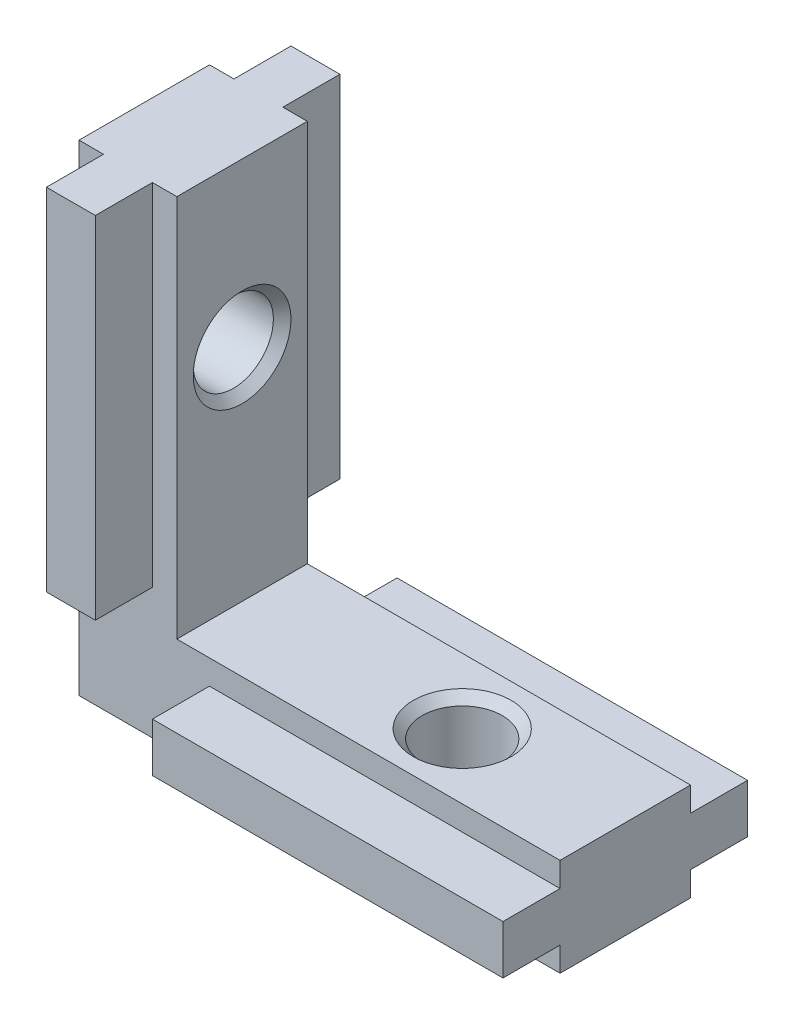
ISO-10303-21;
HEADER;
FILE_DESCRIPTION(('STEP AP214'),'2;1');
FILE_NAME('part.step','',(''),(''),'','','');
FILE_SCHEMA(('AUTOMOTIVE_DESIGN { 1 0 10303 214 1 1 1 1 }'));
ENDSEC;
DATA;
#1=APPLICATION_CONTEXT('core data for automotive mechanical design processes');
#2=APPLICATION_PROTOCOL_DEFINITION('international standard','automotive_design',2000,#1);
#3=PRODUCT_CONTEXT('',#1,'mechanical');
#4=PRODUCT('Part','Part','',(#3));
#5=PRODUCT_RELATED_PRODUCT_CATEGORY('part','',(#4));
#6=PRODUCT_DEFINITION_FORMATION('','',#4);
#7=PRODUCT_DEFINITION_CONTEXT('part definition',#1,'design');
#8=PRODUCT_DEFINITION('design','',#6,#7);
#9=PRODUCT_DEFINITION_SHAPE('','',#8);
#10=(LENGTH_UNIT() NAMED_UNIT(*) SI_UNIT(.MILLI.,.METRE.));
#11=(NAMED_UNIT(*) PLANE_ANGLE_UNIT() SI_UNIT($,.RADIAN.));
#12=(NAMED_UNIT(*) SI_UNIT($,.STERADIAN.) SOLID_ANGLE_UNIT());
#13=UNCERTAINTY_MEASURE_WITH_UNIT(LENGTH_MEASURE(1.E-05),#10,'distance_accuracy_value','');
#14=(GEOMETRIC_REPRESENTATION_CONTEXT(3) GLOBAL_UNCERTAINTY_ASSIGNED_CONTEXT((#13)) GLOBAL_UNIT_ASSIGNED_CONTEXT((#10,
#11,#12)) REPRESENTATION_CONTEXT('',''));
#15=CARTESIAN_POINT('',(0.,0.,0.));
#16=DIRECTION('',(0.,0.,1.));
#17=DIRECTION('',(1.,0.,0.));
#18=AXIS2_PLACEMENT_3D('',#15,#16,#17);
#19=CARTESIAN_POINT('',(6.,19.5,0.));
#20=DIRECTION('',(1.,0.,0.));
#21=DIRECTION('',(0.,0.,-1.));
#22=AXIS2_PLACEMENT_3D('',#19,#20,#21);
#23=CYLINDRICAL_SURFACE('',#22,2.45849999999999);
#24=CARTESIAN_POINT('',(0.540000000000873,19.5,0.));
#25=DIRECTION('',(-1.,0.,0.));
#26=DIRECTION('',(0.,0.,1.));
#27=AXIS2_PLACEMENT_3D('',#24,#25,#26);
#28=CIRCLE('',#27,2.45849999998882);
#29=CARTESIAN_POINT('',(0.540000000000873,19.5,2.45849999998882));
#30=VERTEX_POINT('',#29);
#31=EDGE_CURVE('E200',#30,#30,#28,.T.);
#32=ORIENTED_EDGE('',*,*,#31,.T.);
#33=EDGE_LOOP('',(#32));
#34=FACE_BOUND('',#33,.T.);
#35=CARTESIAN_POINT('',(5.46000000008462,19.5,0.));
#36=DIRECTION('',(1.,0.,0.));
#37=DIRECTION('',(0.,0.,-1.));
#38=AXIS2_PLACEMENT_3D('',#35,#36,#37);
#39=CIRCLE('',#38,2.45849999998882);
#40=CARTESIAN_POINT('',(5.46000000008462,19.5,-2.45849999998882));
#41=VERTEX_POINT('',#40);
#42=EDGE_CURVE('E211',#41,#41,#39,.T.);
#43=ORIENTED_EDGE('',*,*,#42,.T.);
#44=EDGE_LOOP('',(#43));
#45=FACE_BOUND('',#44,.T.);
#46=ADVANCED_FACE('F18',(#34,#45),#23,.F.);
#47=CARTESIAN_POINT('',(29.5,1.5,7.5));
#48=DIRECTION('',(0.,0.,-1.));
#49=DIRECTION('',(-1.,0.,0.));
#50=AXIS2_PLACEMENT_3D('',#47,#48,#49);
#51=PLANE('',#50);
#52=DIRECTION('',(1.,0.,0.));
#53=VECTOR('',#52,1.);
#54=CARTESIAN_POINT('',(0.,29.5,7.5));
#55=LINE('',#54,#53);
#56=CARTESIAN_POINT('',(4.5,29.5,7.5));
#57=VERTEX_POINT('',#56);
#58=CARTESIAN_POINT('',(1.5,29.5,7.5));
#59=VERTEX_POINT('',#58);
#60=EDGE_CURVE('E167',#57,#59,#55,.F.);
#61=ORIENTED_EDGE('',*,*,#60,.T.);
#62=DIRECTION('',(0.,1.,0.));
#63=VECTOR('',#62,1.);
#64=CARTESIAN_POINT('',(1.5,29.5,7.5));
#65=LINE('',#64,#63);
#66=CARTESIAN_POINT('',(1.5,8.,7.5));
#67=VERTEX_POINT('',#66);
#68=EDGE_CURVE('E164',#59,#67,#65,.F.);
#69=ORIENTED_EDGE('',*,*,#68,.T.);
#70=DIRECTION('',(1.,0.,0.));
#71=VECTOR('',#70,1.);
#72=CARTESIAN_POINT('',(8.,8.,7.5));
#73=LINE('',#72,#71);
#74=CARTESIAN_POINT('',(4.5,8.,7.5));
#75=VERTEX_POINT('',#74);
#76=EDGE_CURVE('E268',#75,#67,#73,.F.);
#77=ORIENTED_EDGE('',*,*,#76,.F.);
#78=DIRECTION('',(0.,1.,0.));
#79=VECTOR('',#78,1.);
#80=CARTESIAN_POINT('',(4.5,29.5,7.5));
#81=LINE('',#80,#79);
#82=EDGE_CURVE('E170',#75,#57,#81,.T.);
#83=ORIENTED_EDGE('',*,*,#82,.T.);
#84=EDGE_LOOP('',(#61,#69,#77,#83));
#85=FACE_BOUND('',#84,.T.);
#86=ADVANCED_FACE('F168',(#85),#51,.F.);
#87=CARTESIAN_POINT('',(19.5,6.00000000002865,0.));
#88=DIRECTION('',(0.,1.,0.));
#89=DIRECTION('',(0.,0.,1.));
#90=AXIS2_PLACEMENT_3D('',#87,#88,#89);
#91=CONICAL_SURFACE('',#90,2.99849999998969,0.785398163397448);
#92=CARTESIAN_POINT('',(19.5,6.00000000002865,0.));
#93=DIRECTION('',(0.,1.,0.));
#94=DIRECTION('',(0.,0.,1.));
#95=AXIS2_PLACEMENT_3D('',#92,#93,#94);
#96=CIRCLE('',#95,2.99849999998969);
#97=CARTESIAN_POINT('',(19.5,6.00000000002865,2.99849999998969));
#98=VERTEX_POINT('',#97);
#99=EDGE_CURVE('E21',#98,#98,#96,.T.);
#100=ORIENTED_EDGE('',*,*,#99,.T.);
#101=EDGE_LOOP('',(#100));
#102=FACE_BOUND('',#101,.T.);
#103=CARTESIAN_POINT('',(19.5,5.46,0.));
#104=DIRECTION('',(0.,1.,0.));
#105=DIRECTION('',(0.,0.,1.));
#106=AXIS2_PLACEMENT_3D('',#103,#104,#105);
#107=CIRCLE('',#106,2.4585);
#108=CARTESIAN_POINT('',(19.5,5.46,2.4585));
#109=VERTEX_POINT('',#108);
#110=EDGE_CURVE('E208',#109,#109,#107,.F.);
#111=ORIENTED_EDGE('',*,*,#110,.T.);
#112=EDGE_LOOP('',(#111));
#113=FACE_BOUND('',#112,.T.);
#114=ADVANCED_FACE('F500',(#102,#113),#91,.F.);
#115=CARTESIAN_POINT('',(6.00000000002865,19.5,0.));
#116=DIRECTION('',(1.,0.,0.));
#117=DIRECTION('',(0.,0.,-1.));
#118=AXIS2_PLACEMENT_3D('',#115,#116,#117);
#119=CONICAL_SURFACE('',#118,2.99849999993285,0.785398163397448);
#120=CARTESIAN_POINT('',(6.00000000002865,19.5,0.));
#121=DIRECTION('',(1.,0.,0.));
#122=DIRECTION('',(0.,0.,-1.));
#123=AXIS2_PLACEMENT_3D('',#120,#121,#122);
#124=CIRCLE('',#123,2.99849999993285);
#125=CARTESIAN_POINT('',(6.00000000002865,19.5,-2.99849999993285));
#126=VERTEX_POINT('',#125);
#127=EDGE_CURVE('E221',#126,#126,#124,.T.);
#128=ORIENTED_EDGE('',*,*,#127,.T.);
#129=EDGE_LOOP('',(#128));
#130=FACE_BOUND('',#129,.T.);
#131=ORIENTED_EDGE('',*,*,#42,.F.);
#132=EDGE_LOOP('',(#131));
#133=FACE_BOUND('',#132,.T.);
#134=ADVANCED_FACE('F496',(#130,#133),#119,.F.);
#135=CARTESIAN_POINT('',(29.5,4.5,-7.5));
#136=DIRECTION('',(0.,0.,1.));
#137=DIRECTION('',(1.,0.,0.));
#138=AXIS2_PLACEMENT_3D('',#135,#136,#137);
#139=PLANE('',#138);
#140=DIRECTION('',(1.,0.,0.));
#141=VECTOR('',#140,1.);
#142=CARTESIAN_POINT('',(0.,29.5,-7.5));
#143=LINE('',#142,#141);
#144=CARTESIAN_POINT('',(1.5,29.5,-7.5));
#145=VERTEX_POINT('',#144);
#146=CARTESIAN_POINT('',(4.5,29.5,-7.5));
#147=VERTEX_POINT('',#146);
#148=EDGE_CURVE('E195',#145,#147,#143,.T.);
#149=ORIENTED_EDGE('',*,*,#148,.T.);
#150=DIRECTION('',(0.,1.,0.));
#151=VECTOR('',#150,1.);
#152=CARTESIAN_POINT('',(4.5,29.5,-7.5));
#153=LINE('',#152,#151);
#154=CARTESIAN_POINT('',(4.5,8.,-7.5));
#155=VERTEX_POINT('',#154);
#156=EDGE_CURVE('E300',#147,#155,#153,.F.);
#157=ORIENTED_EDGE('',*,*,#156,.T.);
#158=DIRECTION('',(1.,0.,0.));
#159=VECTOR('',#158,1.);
#160=CARTESIAN_POINT('',(8.,8.,-7.5));
#161=LINE('',#160,#159);
#162=CARTESIAN_POINT('',(1.5,8.,-7.5));
#163=VERTEX_POINT('',#162);
#164=EDGE_CURVE('E295',#163,#155,#161,.T.);
#165=ORIENTED_EDGE('',*,*,#164,.F.);
#166=DIRECTION('',(0.,1.,0.));
#167=VECTOR('',#166,1.);
#168=CARTESIAN_POINT('',(1.5,29.5,-7.5));
#169=LINE('',#168,#167);
#170=EDGE_CURVE('E289',#163,#145,#169,.T.);
#171=ORIENTED_EDGE('',*,*,#170,.T.);
#172=EDGE_LOOP('',(#149,#157,#165,#171));
#173=FACE_BOUND('',#172,.T.);
#174=ADVANCED_FACE('F492',(#173),#139,.F.);
#175=CARTESIAN_POINT('',(19.5,6.,0.));
#176=DIRECTION('',(0.,1.,0.));
#177=DIRECTION('',(0.,0.,1.));
#178=AXIS2_PLACEMENT_3D('',#175,#176,#177);
#179=CYLINDRICAL_SURFACE('',#178,2.4585);
#180=ORIENTED_EDGE('',*,*,#110,.F.);
#181=EDGE_LOOP('',(#180));
#182=FACE_BOUND('',#181,.T.);
#183=CARTESIAN_POINT('',(19.5,0.540000000000873,0.));
#184=DIRECTION('',(0.,-1.,0.));
#185=DIRECTION('',(0.,0.,-1.));
#186=AXIS2_PLACEMENT_3D('',#183,#184,#185);
#187=CIRCLE('',#186,2.45849999998882);
#188=CARTESIAN_POINT('',(19.5,0.540000000000873,-2.45849999998882));
#189=VERTEX_POINT('',#188);
#190=EDGE_CURVE('E201',#189,#189,#187,.T.);
#191=ORIENTED_EDGE('',*,*,#190,.T.);
#192=EDGE_LOOP('',(#191));
#193=FACE_BOUND('',#192,.T.);
#194=ADVANCED_FACE('F488',(#182,#193),#179,.F.);
#195=CARTESIAN_POINT('',(5.6843418860808E-11,19.5,0.));
#196=DIRECTION('',(-1.,0.,0.));
#197=DIRECTION('',(0.,0.,1.));
#198=AXIS2_PLACEMENT_3D('',#195,#196,#197);
#199=CONICAL_SURFACE('',#198,2.99849999993285,0.785398163344815);
#200=ORIENTED_EDGE('',*,*,#31,.F.);
#201=EDGE_LOOP('',(#200));
#202=FACE_BOUND('',#201,.T.);
#203=CARTESIAN_POINT('',(0.,19.5,0.));
#204=DIRECTION('',(-1.,0.,0.));
#205=DIRECTION('',(0.,0.,1.));
#206=AXIS2_PLACEMENT_3D('',#203,#204,#205);
#207=CIRCLE('',#206,2.99849999998969);
#208=CARTESIAN_POINT('',(0.,19.5,2.99849999998969));
#209=VERTEX_POINT('',#208);
#210=EDGE_CURVE('E204',#209,#209,#207,.F.);
#211=ORIENTED_EDGE('',*,*,#210,.F.);
#212=EDGE_LOOP('',(#211));
#213=FACE_BOUND('',#212,.T.);
#214=ADVANCED_FACE('F485',(#202,#213),#199,.F.);
#215=CARTESIAN_POINT('',(0.,29.5,0.));
#216=DIRECTION('',(0.,-1.,0.));
#217=DIRECTION('',(0.,0.,-1.));
#218=AXIS2_PLACEMENT_3D('',#215,#216,#217);
#219=PLANE('',#218);
#220=ORIENTED_EDGE('',*,*,#60,.F.);
#221=DIRECTION('',(0.,0.,1.));
#222=VECTOR('',#221,1.);
#223=CARTESIAN_POINT('',(4.5,29.5,4.));
#224=LINE('',#223,#222);
#225=CARTESIAN_POINT('',(4.5,29.5,4.));
#226=VERTEX_POINT('',#225);
#227=EDGE_CURVE('E262',#57,#226,#224,.F.);
#228=ORIENTED_EDGE('',*,*,#227,.T.);
#229=DIRECTION('',(1.,0.,0.));
#230=VECTOR('',#229,1.);
#231=CARTESIAN_POINT('',(0.,29.5,4.));
#232=LINE('',#231,#230);
#233=CARTESIAN_POINT('',(6.,29.5,4.));
#234=VERTEX_POINT('',#233);
#235=EDGE_CURVE('E176',#234,#226,#232,.F.);
#236=ORIENTED_EDGE('',*,*,#235,.F.);
#237=DIRECTION('',(0.,0.,1.));
#238=VECTOR('',#237,1.);
#239=CARTESIAN_POINT('',(6.,29.5,-4.));
#240=LINE('',#239,#238);
#241=CARTESIAN_POINT('',(6.,29.5,-4.));
#242=VERTEX_POINT('',#241);
#243=EDGE_CURVE('E223',#234,#242,#240,.F.);
#244=ORIENTED_EDGE('',*,*,#243,.T.);
#245=DIRECTION('',(1.,0.,0.));
#246=VECTOR('',#245,1.);
#247=CARTESIAN_POINT('',(0.,29.5,-4.));
#248=LINE('',#247,#246);
#249=CARTESIAN_POINT('',(4.5,29.5,-4.));
#250=VERTEX_POINT('',#249);
#251=EDGE_CURVE('E193',#250,#242,#248,.T.);
#252=ORIENTED_EDGE('',*,*,#251,.F.);
#253=DIRECTION('',(0.,0.,1.));
#254=VECTOR('',#253,1.);
#255=CARTESIAN_POINT('',(4.5,29.5,-7.5));
#256=LINE('',#255,#254);
#257=EDGE_CURVE('E302',#250,#147,#256,.F.);
#258=ORIENTED_EDGE('',*,*,#257,.T.);
#259=ORIENTED_EDGE('',*,*,#148,.F.);
#260=DIRECTION('',(0.,0.,-1.));
#261=VECTOR('',#260,1.);
#262=CARTESIAN_POINT('',(1.5,29.5,-4.));
#263=LINE('',#262,#261);
#264=CARTESIAN_POINT('',(1.5,29.5,-4.));
#265=VERTEX_POINT('',#264);
#266=EDGE_CURVE('E205',#145,#265,#263,.F.);
#267=ORIENTED_EDGE('',*,*,#266,.T.);
#268=DIRECTION('',(1.,0.,0.));
#269=VECTOR('',#268,1.);
#270=CARTESIAN_POINT('',(0.,29.5,-4.));
#271=LINE('',#270,#269);
#272=CARTESIAN_POINT('',(0.,29.5,-4.));
#273=VERTEX_POINT('',#272);
#274=EDGE_CURVE('E197',#273,#265,#271,.T.);
#275=ORIENTED_EDGE('',*,*,#274,.F.);
#276=DIRECTION('',(0.,0.,1.));
#277=VECTOR('',#276,1.);
#278=CARTESIAN_POINT('',(0.,29.5,0.));
#279=LINE('',#278,#277);
#280=CARTESIAN_POINT('',(0.,29.5,4.));
#281=VERTEX_POINT('',#280);
#282=EDGE_CURVE('E220',#281,#273,#279,.F.);
#283=ORIENTED_EDGE('',*,*,#282,.F.);
#284=DIRECTION('',(1.,0.,0.));
#285=VECTOR('',#284,1.);
#286=CARTESIAN_POINT('',(0.,29.5,4.));
#287=LINE('',#286,#285);
#288=CARTESIAN_POINT('',(1.5,29.5,4.));
#289=VERTEX_POINT('',#288);
#290=EDGE_CURVE('E188',#289,#281,#287,.F.);
#291=ORIENTED_EDGE('',*,*,#290,.F.);
#292=DIRECTION('',(0.,0.,-1.));
#293=VECTOR('',#292,1.);
#294=CARTESIAN_POINT('',(1.5,29.5,7.5));
#295=LINE('',#294,#293);
#296=EDGE_CURVE('E175',#289,#59,#295,.F.);
#297=ORIENTED_EDGE('',*,*,#296,.T.);
#298=EDGE_LOOP('',(#220,#228,#236,#244,#252,#258,#259,#267,#275,#283,#291,#297));
#299=FACE_BOUND('',#298,.T.);
#300=ADVANCED_FACE('F186',(#299),#219,.F.);
#301=CARTESIAN_POINT('',(1.5,29.5,7.5));
#302=DIRECTION('',(1.,0.,0.));
#303=DIRECTION('',(0.,0.,-1.));
#304=AXIS2_PLACEMENT_3D('',#301,#302,#303);
#305=PLANE('',#304);
#306=ORIENTED_EDGE('',*,*,#296,.F.);
#307=DIRECTION('',(0.,1.,0.));
#308=VECTOR('',#307,1.);
#309=CARTESIAN_POINT('',(1.5,0.,4.));
#310=LINE('',#309,#308);
#311=CARTESIAN_POINT('',(1.5,8.,4.));
#312=VERTEX_POINT('',#311);
#313=EDGE_CURVE('E278',#289,#312,#310,.F.);
#314=ORIENTED_EDGE('',*,*,#313,.T.);
#315=DIRECTION('',(0.,0.,-1.));
#316=VECTOR('',#315,1.);
#317=CARTESIAN_POINT('',(1.5,8.,7.50000000000001));
#318=LINE('',#317,#316);
#319=EDGE_CURVE('E184',#67,#312,#318,.T.);
#320=ORIENTED_EDGE('',*,*,#319,.F.);
#321=ORIENTED_EDGE('',*,*,#68,.F.);
#322=EDGE_LOOP('',(#306,#314,#320,#321));
#323=FACE_BOUND('',#322,.T.);
#324=ADVANCED_FACE('F181',(#323),#305,.F.);
#325=CARTESIAN_POINT('',(8.,8.,7.50000000000001));
#326=DIRECTION('',(0.,-1.,0.));
#327=DIRECTION('',(0.,0.,-1.));
#328=AXIS2_PLACEMENT_3D('',#325,#326,#327);
#329=PLANE('',#328);
#330=DIRECTION('',(0.,0.,1.));
#331=VECTOR('',#330,1.);
#332=CARTESIAN_POINT('',(4.5,8.,4.));
#333=LINE('',#332,#331);
#334=CARTESIAN_POINT('',(4.5,8.,4.));
#335=VERTEX_POINT('',#334);
#336=EDGE_CURVE('E265',#335,#75,#333,.T.);
#337=ORIENTED_EDGE('',*,*,#336,.T.);
#338=ORIENTED_EDGE('',*,*,#76,.T.);
#339=ORIENTED_EDGE('',*,*,#319,.T.);
#340=DIRECTION('',(-1.,0.,0.));
#341=VECTOR('',#340,1.);
#342=CARTESIAN_POINT('',(29.5,8.,4.));
#343=LINE('',#342,#341);
#344=EDGE_CURVE('E273',#312,#335,#343,.F.);
#345=ORIENTED_EDGE('',*,*,#344,.T.);
#346=EDGE_LOOP('',(#337,#338,#339,#345));
#347=FACE_BOUND('',#346,.T.);
#348=ADVANCED_FACE('F272',(#347),#329,.T.);
#349=CARTESIAN_POINT('',(4.5,29.5,4.));
#350=DIRECTION('',(-1.,0.,0.));
#351=DIRECTION('',(0.,0.,1.));
#352=AXIS2_PLACEMENT_3D('',#349,#350,#351);
#353=PLANE('',#352);
#354=ORIENTED_EDGE('',*,*,#227,.F.);
#355=ORIENTED_EDGE('',*,*,#82,.F.);
#356=ORIENTED_EDGE('',*,*,#336,.F.);
#357=DIRECTION('',(0.,1.,0.));
#358=VECTOR('',#357,1.);
#359=CARTESIAN_POINT('',(4.5,0.,4.));
#360=LINE('',#359,#358);
#361=EDGE_CURVE('E280',#335,#226,#360,.T.);
#362=ORIENTED_EDGE('',*,*,#361,.T.);
#363=EDGE_LOOP('',(#354,#355,#356,#362));
#364=FACE_BOUND('',#363,.T.);
#365=ADVANCED_FACE('F474',(#364),#353,.F.);
#366=CARTESIAN_POINT('',(8.,0.,0.));
#367=DIRECTION('',(1.,0.,0.));
#368=DIRECTION('',(0.,0.,-1.));
#369=AXIS2_PLACEMENT_3D('',#366,#367,#368);
#370=PLANE('',#369);
#371=DIRECTION('',(0.,1.,0.));
#372=VECTOR('',#371,1.);
#373=CARTESIAN_POINT('',(8.,1.5,7.5));
#374=LINE('',#373,#372);
#375=CARTESIAN_POINT('',(8.,1.5,7.5));
#376=VERTEX_POINT('',#375);
#377=CARTESIAN_POINT('',(8.,4.5,7.5));
#378=VERTEX_POINT('',#377);
#379=EDGE_CURVE('E255',#376,#378,#374,.T.);
#380=ORIENTED_EDGE('',*,*,#379,.T.);
#381=DIRECTION('',(0.,0.,-1.));
#382=VECTOR('',#381,1.);
#383=CARTESIAN_POINT('',(8.,4.5,7.5));
#384=LINE('',#383,#382);
#385=CARTESIAN_POINT('',(8.,4.5,4.));
#386=VERTEX_POINT('',#385);
#387=EDGE_CURVE('E250',#378,#386,#384,.T.);
#388=ORIENTED_EDGE('',*,*,#387,.T.);
#389=DIRECTION('',(0.,1.,0.));
#390=VECTOR('',#389,1.);
#391=CARTESIAN_POINT('',(8.,0.,4.));
#392=LINE('',#391,#390);
#393=CARTESIAN_POINT('',(8.,1.5,4.));
#394=VERTEX_POINT('',#393);
#395=EDGE_CURVE('E331',#386,#394,#392,.F.);
#396=ORIENTED_EDGE('',*,*,#395,.T.);
#397=DIRECTION('',(0.,0.,1.));
#398=VECTOR('',#397,1.);
#399=CARTESIAN_POINT('',(8.,1.5,4.));
#400=LINE('',#399,#398);
#401=EDGE_CURVE('E260',#394,#376,#400,.T.);
#402=ORIENTED_EDGE('',*,*,#401,.T.);
#403=EDGE_LOOP('',(#380,#388,#396,#402));
#404=FACE_BOUND('',#403,.T.);
#405=ADVANCED_FACE('F471',(#404),#370,.F.);
#406=CARTESIAN_POINT('',(29.5,4.5,-7.5));
#407=DIRECTION('',(0.,0.,1.));
#408=DIRECTION('',(1.,0.,0.));
#409=AXIS2_PLACEMENT_3D('',#406,#407,#408);
#410=PLANE('',#409);
#411=DIRECTION('',(0.,1.,0.));
#412=VECTOR('',#411,1.);
#413=CARTESIAN_POINT('',(29.5,0.,-7.5));
#414=LINE('',#413,#412);
#415=CARTESIAN_POINT('',(29.5,4.5,-7.5));
#416=VERTEX_POINT('',#415);
#417=CARTESIAN_POINT('',(29.5,1.5,-7.5));
#418=VERTEX_POINT('',#417);
#419=EDGE_CURVE('E345',#416,#418,#414,.F.);
#420=ORIENTED_EDGE('',*,*,#419,.T.);
#421=DIRECTION('',(1.,0.,0.));
#422=VECTOR('',#421,1.);
#423=CARTESIAN_POINT('',(29.5,1.5,-7.5));
#424=LINE('',#423,#422);
#425=CARTESIAN_POINT('',(8.,1.5,-7.5));
#426=VERTEX_POINT('',#425);
#427=EDGE_CURVE('E247',#418,#426,#424,.F.);
#428=ORIENTED_EDGE('',*,*,#427,.T.);
#429=DIRECTION('',(0.,1.,0.));
#430=VECTOR('',#429,1.);
#431=CARTESIAN_POINT('',(8.,0.,-7.5));
#432=LINE('',#431,#430);
#433=CARTESIAN_POINT('',(8.,4.5,-7.5));
#434=VERTEX_POINT('',#433);
#435=EDGE_CURVE('E245',#434,#426,#432,.F.);
#436=ORIENTED_EDGE('',*,*,#435,.F.);
#437=DIRECTION('',(1.,0.,0.));
#438=VECTOR('',#437,1.);
#439=CARTESIAN_POINT('',(29.5,4.5,-7.5));
#440=LINE('',#439,#438);
#441=EDGE_CURVE('E230',#434,#416,#440,.T.);
#442=ORIENTED_EDGE('',*,*,#441,.T.);
#443=EDGE_LOOP('',(#420,#428,#436,#442));
#444=FACE_BOUND('',#443,.T.);
#445=ADVANCED_FACE('F467',(#444),#410,.F.);
#446=CARTESIAN_POINT('',(29.5,1.5,4.));
#447=DIRECTION('',(0.,1.,0.));
#448=DIRECTION('',(0.,0.,1.));
#449=AXIS2_PLACEMENT_3D('',#446,#447,#448);
#450=PLANE('',#449);
#451=DIRECTION('',(-1.,0.,0.));
#452=VECTOR('',#451,1.);
#453=CARTESIAN_POINT('',(29.5,1.5,4.));
#454=LINE('',#453,#452);
#455=CARTESIAN_POINT('',(29.5,1.5,4.));
#456=VERTEX_POINT('',#455);
#457=EDGE_CURVE('E334',#394,#456,#454,.F.);
#458=ORIENTED_EDGE('',*,*,#457,.T.);
#459=DIRECTION('',(0.,0.,1.));
#460=VECTOR('',#459,1.);
#461=CARTESIAN_POINT('',(29.5,1.5,0.));
#462=LINE('',#461,#460);
#463=CARTESIAN_POINT('',(29.5,1.5,7.5));
#464=VERTEX_POINT('',#463);
#465=EDGE_CURVE('E352',#456,#464,#462,.T.);
#466=ORIENTED_EDGE('',*,*,#465,.T.);
#467=DIRECTION('',(-1.,0.,0.));
#468=VECTOR('',#467,1.);
#469=CARTESIAN_POINT('',(29.5,1.5,7.5));
#470=LINE('',#469,#468);
#471=EDGE_CURVE('E257',#464,#376,#470,.T.);
#472=ORIENTED_EDGE('',*,*,#471,.T.);
#473=ORIENTED_EDGE('',*,*,#401,.F.);
#474=EDGE_LOOP('',(#458,#466,#472,#473));
#475=FACE_BOUND('',#474,.T.);
#476=ADVANCED_FACE('F463',(#475),#450,.F.);
#477=CARTESIAN_POINT('',(29.5,1.5,7.5));
#478=DIRECTION('',(0.,0.,-1.));
#479=DIRECTION('',(-1.,0.,0.));
#480=AXIS2_PLACEMENT_3D('',#477,#478,#479);
#481=PLANE('',#480);
#482=ORIENTED_EDGE('',*,*,#471,.F.);
#483=DIRECTION('',(0.,1.,0.));
#484=VECTOR('',#483,1.);
#485=CARTESIAN_POINT('',(29.5,0.,7.5));
#486=LINE('',#485,#484);
#487=CARTESIAN_POINT('',(29.5,4.5,7.5));
#488=VERTEX_POINT('',#487);
#489=EDGE_CURVE('E355',#464,#488,#486,.T.);
#490=ORIENTED_EDGE('',*,*,#489,.T.);
#491=DIRECTION('',(1.,0.,0.));
#492=VECTOR('',#491,1.);
#493=CARTESIAN_POINT('',(29.5,4.5,7.5));
#494=LINE('',#493,#492);
#495=EDGE_CURVE('E252',#488,#378,#494,.F.);
#496=ORIENTED_EDGE('',*,*,#495,.T.);
#497=ORIENTED_EDGE('',*,*,#379,.F.);
#498=EDGE_LOOP('',(#482,#490,#496,#497));
#499=FACE_BOUND('',#498,.T.);
#500=ADVANCED_FACE('F459',(#499),#481,.F.);
#501=CARTESIAN_POINT('',(29.5,4.5,7.5));
#502=DIRECTION('',(0.,-1.,0.));
#503=DIRECTION('',(0.,0.,-1.));
#504=AXIS2_PLACEMENT_3D('',#501,#502,#503);
#505=PLANE('',#504);
#506=ORIENTED_EDGE('',*,*,#495,.F.);
#507=DIRECTION('',(0.,0.,1.));
#508=VECTOR('',#507,1.);
#509=CARTESIAN_POINT('',(29.5,4.5,0.));
#510=LINE('',#509,#508);
#511=CARTESIAN_POINT('',(29.5,4.5,4.));
#512=VERTEX_POINT('',#511);
#513=EDGE_CURVE('E358',#488,#512,#510,.F.);
#514=ORIENTED_EDGE('',*,*,#513,.T.);
#515=DIRECTION('',(-1.,0.,0.));
#516=VECTOR('',#515,1.);
#517=CARTESIAN_POINT('',(29.5,4.5,4.));
#518=LINE('',#517,#516);
#519=EDGE_CURVE('E322',#512,#386,#518,.T.);
#520=ORIENTED_EDGE('',*,*,#519,.T.);
#521=ORIENTED_EDGE('',*,*,#387,.F.);
#522=EDGE_LOOP('',(#506,#514,#520,#521));
#523=FACE_BOUND('',#522,.T.);
#524=ADVANCED_FACE('F455',(#523),#505,.F.);
#525=CARTESIAN_POINT('',(29.5,1.5,-7.5));
#526=DIRECTION('',(0.,1.,0.));
#527=DIRECTION('',(0.,0.,1.));
#528=AXIS2_PLACEMENT_3D('',#525,#526,#527);
#529=PLANE('',#528);
#530=DIRECTION('',(0.,0.,1.));
#531=VECTOR('',#530,1.);
#532=CARTESIAN_POINT('',(29.5,1.5,0.));
#533=LINE('',#532,#531);
#534=CARTESIAN_POINT('',(29.5,1.5,-4.));
#535=VERTEX_POINT('',#534);
#536=EDGE_CURVE('E347',#418,#535,#533,.T.);
#537=ORIENTED_EDGE('',*,*,#536,.T.);
#538=DIRECTION('',(1.,0.,0.));
#539=VECTOR('',#538,1.);
#540=CARTESIAN_POINT('',(29.5,1.5,-4.));
#541=LINE('',#540,#539);
#542=CARTESIAN_POINT('',(8.,1.5,-4.));
#543=VERTEX_POINT('',#542);
#544=EDGE_CURVE('E362',#535,#543,#541,.F.);
#545=ORIENTED_EDGE('',*,*,#544,.T.);
#546=DIRECTION('',(0.,0.,1.));
#547=VECTOR('',#546,1.);
#548=CARTESIAN_POINT('',(8.,1.5,0.));
#549=LINE('',#548,#547);
#550=EDGE_CURVE('E240',#426,#543,#549,.T.);
#551=ORIENTED_EDGE('',*,*,#550,.F.);
#552=ORIENTED_EDGE('',*,*,#427,.F.);
#553=EDGE_LOOP('',(#537,#545,#551,#552));
#554=FACE_BOUND('',#553,.T.);
#555=ADVANCED_FACE('F451',(#554),#529,.F.);
#556=CARTESIAN_POINT('',(8.,0.,0.));
#557=DIRECTION('',(-1.,0.,0.));
#558=DIRECTION('',(0.,0.,1.));
#559=AXIS2_PLACEMENT_3D('',#556,#557,#558);
#560=PLANE('',#559);
#561=ORIENTED_EDGE('',*,*,#550,.T.);
#562=DIRECTION('',(0.,1.,0.));
#563=VECTOR('',#562,1.);
#564=CARTESIAN_POINT('',(8.,6.,-4.));
#565=LINE('',#564,#563);
#566=CARTESIAN_POINT('',(8.,4.5,-4.));
#567=VERTEX_POINT('',#566);
#568=EDGE_CURVE('E365',#543,#567,#565,.T.);
#569=ORIENTED_EDGE('',*,*,#568,.T.);
#570=DIRECTION('',(0.,0.,-1.));
#571=VECTOR('',#570,1.);
#572=CARTESIAN_POINT('',(8.,4.5,-4.));
#573=LINE('',#572,#571);
#574=EDGE_CURVE('E233',#567,#434,#573,.T.);
#575=ORIENTED_EDGE('',*,*,#574,.T.);
#576=ORIENTED_EDGE('',*,*,#435,.T.);
#577=EDGE_LOOP('',(#561,#569,#575,#576));
#578=FACE_BOUND('',#577,.T.);
#579=ADVANCED_FACE('F447',(#578),#560,.T.);
#580=CARTESIAN_POINT('',(29.5,4.5,-4.));
#581=DIRECTION('',(0.,-1.,0.));
#582=DIRECTION('',(0.,0.,-1.));
#583=AXIS2_PLACEMENT_3D('',#580,#581,#582);
#584=PLANE('',#583);
#585=DIRECTION('',(0.,0.,1.));
#586=VECTOR('',#585,1.);
#587=CARTESIAN_POINT('',(29.5,4.5,0.));
#588=LINE('',#587,#586);
#589=CARTESIAN_POINT('',(29.5,4.5,-4.));
#590=VERTEX_POINT('',#589);
#591=EDGE_CURVE('E342',#590,#416,#588,.F.);
#592=ORIENTED_EDGE('',*,*,#591,.T.);
#593=ORIENTED_EDGE('',*,*,#441,.F.);
#594=ORIENTED_EDGE('',*,*,#574,.F.);
#595=DIRECTION('',(1.,0.,0.));
#596=VECTOR('',#595,1.);
#597=CARTESIAN_POINT('',(29.5,4.5,-4.));
#598=LINE('',#597,#596);
#599=EDGE_CURVE('E368',#567,#590,#598,.T.);
#600=ORIENTED_EDGE('',*,*,#599,.T.);
#601=EDGE_LOOP('',(#592,#593,#594,#600));
#602=FACE_BOUND('',#601,.T.);
#603=ADVANCED_FACE('F444',(#602),#584,.F.);
#604=CARTESIAN_POINT('',(29.5,6.,4.));
#605=DIRECTION('',(0.,-1.,0.));
#606=DIRECTION('',(0.,0.,-1.));
#607=AXIS2_PLACEMENT_3D('',#604,#605,#606);
#608=PLANE('',#607);
#609=DIRECTION('',(0.,0.,1.));
#610=VECTOR('',#609,1.);
#611=CARTESIAN_POINT('',(29.5,6.,0.));
#612=LINE('',#611,#610);
#613=CARTESIAN_POINT('',(29.5,6.,4.));
#614=VERTEX_POINT('',#613);
#615=CARTESIAN_POINT('',(29.5,6.,-4.));
#616=VERTEX_POINT('',#615);
#617=EDGE_CURVE('E340',#614,#616,#612,.F.);
#618=ORIENTED_EDGE('',*,*,#617,.T.);
#619=DIRECTION('',(1.,0.,0.));
#620=VECTOR('',#619,1.);
#621=CARTESIAN_POINT('',(29.5,6.,-4.));
#622=LINE('',#621,#620);
#623=CARTESIAN_POINT('',(6.,6.,-4.));
#624=VERTEX_POINT('',#623);
#625=EDGE_CURVE('E312',#616,#624,#622,.F.);
#626=ORIENTED_EDGE('',*,*,#625,.T.);
#627=DIRECTION('',(0.,0.,1.));
#628=VECTOR('',#627,1.);
#629=CARTESIAN_POINT('',(6.,6.,-4.));
#630=LINE('',#629,#628);
#631=CARTESIAN_POINT('',(6.,6.,4.));
#632=VERTEX_POINT('',#631);
#633=EDGE_CURVE('E227',#624,#632,#630,.T.);
#634=ORIENTED_EDGE('',*,*,#633,.T.);
#635=DIRECTION('',(-1.,0.,0.));
#636=VECTOR('',#635,1.);
#637=CARTESIAN_POINT('',(29.5,6.,4.));
#638=LINE('',#637,#636);
#639=EDGE_CURVE('E309',#632,#614,#638,.F.);
#640=ORIENTED_EDGE('',*,*,#639,.T.);
#641=EDGE_LOOP('',(#618,#626,#634,#640));
#642=FACE_BOUND('',#641,.T.);
#643=ORIENTED_EDGE('',*,*,#99,.F.);
#644=EDGE_LOOP('',(#643));
#645=FACE_BOUND('',#644,.T.);
#646=ADVANCED_FACE('F307',(#642,#645),#608,.F.);
#647=CARTESIAN_POINT('',(6.,29.5,-4.));
#648=DIRECTION('',(-1.,0.,0.));
#649=DIRECTION('',(0.,0.,1.));
#650=AXIS2_PLACEMENT_3D('',#647,#648,#649);
#651=PLANE('',#650);
#652=DIRECTION('',(0.,1.,0.));
#653=VECTOR('',#652,1.);
#654=CARTESIAN_POINT('',(6.,6.,-4.));
#655=LINE('',#654,#653);
#656=EDGE_CURVE('E375',#624,#242,#655,.T.);
#657=ORIENTED_EDGE('',*,*,#656,.T.);
#658=ORIENTED_EDGE('',*,*,#243,.F.);
#659=DIRECTION('',(0.,1.,0.));
#660=VECTOR('',#659,1.);
#661=CARTESIAN_POINT('',(6.,0.,4.));
#662=LINE('',#661,#660);
#663=EDGE_CURVE('E319',#234,#632,#662,.F.);
#664=ORIENTED_EDGE('',*,*,#663,.T.);
#665=ORIENTED_EDGE('',*,*,#633,.F.);
#666=EDGE_LOOP('',(#657,#658,#664,#665));
#667=FACE_BOUND('',#666,.T.);
#668=ORIENTED_EDGE('',*,*,#127,.F.);
#669=EDGE_LOOP('',(#668));
#670=FACE_BOUND('',#669,.T.);
#671=ADVANCED_FACE('F325',(#667,#670),#651,.F.);
#672=CARTESIAN_POINT('',(4.5,29.5,-7.5));
#673=DIRECTION('',(-1.,0.,0.));
#674=DIRECTION('',(0.,0.,1.));
#675=AXIS2_PLACEMENT_3D('',#672,#673,#674);
#676=PLANE('',#675);
#677=ORIENTED_EDGE('',*,*,#257,.F.);
#678=DIRECTION('',(0.,1.,0.));
#679=VECTOR('',#678,1.);
#680=CARTESIAN_POINT('',(4.5,6.,-4.));
#681=LINE('',#680,#679);
#682=CARTESIAN_POINT('',(4.5,8.,-4.));
#683=VERTEX_POINT('',#682);
#684=EDGE_CURVE('E377',#250,#683,#681,.F.);
#685=ORIENTED_EDGE('',*,*,#684,.T.);
#686=DIRECTION('',(0.,0.,-1.));
#687=VECTOR('',#686,1.);
#688=CARTESIAN_POINT('',(4.5,8.,-7.50000000000001));
#689=LINE('',#688,#687);
#690=EDGE_CURVE('E298',#155,#683,#689,.F.);
#691=ORIENTED_EDGE('',*,*,#690,.F.);
#692=ORIENTED_EDGE('',*,*,#156,.F.);
#693=EDGE_LOOP('',(#677,#685,#691,#692));
#694=FACE_BOUND('',#693,.T.);
#695=ADVANCED_FACE('F435',(#694),#676,.F.);
#696=CARTESIAN_POINT('',(8.,8.,-7.50000000000001));
#697=DIRECTION('',(0.,-1.,0.));
#698=DIRECTION('',(0.,0.,-1.));
#699=AXIS2_PLACEMENT_3D('',#696,#697,#698);
#700=PLANE('',#699);
#701=DIRECTION('',(0.,0.,-1.));
#702=VECTOR('',#701,1.);
#703=CARTESIAN_POINT('',(1.5,8.,-4.));
#704=LINE('',#703,#702);
#705=CARTESIAN_POINT('',(1.5,8.,-4.));
#706=VERTEX_POINT('',#705);
#707=EDGE_CURVE('E292',#706,#163,#704,.T.);
#708=ORIENTED_EDGE('',*,*,#707,.T.);
#709=ORIENTED_EDGE('',*,*,#164,.T.);
#710=ORIENTED_EDGE('',*,*,#690,.T.);
#711=DIRECTION('',(1.,0.,0.));
#712=VECTOR('',#711,1.);
#713=CARTESIAN_POINT('',(29.5,8.,-4.));
#714=LINE('',#713,#712);
#715=EDGE_CURVE('E380',#683,#706,#714,.F.);
#716=ORIENTED_EDGE('',*,*,#715,.T.);
#717=EDGE_LOOP('',(#708,#709,#710,#716));
#718=FACE_BOUND('',#717,.T.);
#719=ADVANCED_FACE('F431',(#718),#700,.T.);
#720=CARTESIAN_POINT('',(1.5,29.5,-4.));
#721=DIRECTION('',(1.,0.,0.));
#722=DIRECTION('',(0.,0.,-1.));
#723=AXIS2_PLACEMENT_3D('',#720,#721,#722);
#724=PLANE('',#723);
#725=ORIENTED_EDGE('',*,*,#266,.F.);
#726=ORIENTED_EDGE('',*,*,#170,.F.);
#727=ORIENTED_EDGE('',*,*,#707,.F.);
#728=DIRECTION('',(0.,1.,0.));
#729=VECTOR('',#728,1.);
#730=CARTESIAN_POINT('',(1.5,6.,-4.));
#731=LINE('',#730,#729);
#732=EDGE_CURVE('E383',#706,#265,#731,.T.);
#733=ORIENTED_EDGE('',*,*,#732,.T.);
#734=EDGE_LOOP('',(#725,#726,#727,#733));
#735=FACE_BOUND('',#734,.T.);
#736=ADVANCED_FACE('F427',(#735),#724,.F.);
#737=CARTESIAN_POINT('',(19.5,1.13686837721616E-10,0.));
#738=DIRECTION('',(0.,-1.,0.));
#739=DIRECTION('',(0.,0.,-1.));
#740=AXIS2_PLACEMENT_3D('',#737,#738,#739);
#741=CONICAL_SURFACE('',#740,2.99849999993285,0.785398163397448);
#742=CARTESIAN_POINT('',(19.5,0.,0.));
#743=DIRECTION('',(0.,-1.,0.));
#744=DIRECTION('',(0.,0.,-1.));
#745=AXIS2_PLACEMENT_3D('',#742,#743,#744);
#746=CIRCLE('',#745,2.99850000004653);
#747=CARTESIAN_POINT('',(19.5,0.,-2.99850000004653));
#748=VERTEX_POINT('',#747);
#749=EDGE_CURVE('E214',#748,#748,#746,.T.);
#750=ORIENTED_EDGE('',*,*,#749,.T.);
#751=EDGE_LOOP('',(#750));
#752=FACE_BOUND('',#751,.T.);
#753=ORIENTED_EDGE('',*,*,#190,.F.);
#754=EDGE_LOOP('',(#753));
#755=FACE_BOUND('',#754,.T.);
#756=ADVANCED_FACE('F424',(#752,#755),#741,.F.);
#757=CARTESIAN_POINT('',(0.,0.,0.));
#758=DIRECTION('',(-1.,0.,0.));
#759=DIRECTION('',(0.,0.,1.));
#760=AXIS2_PLACEMENT_3D('',#757,#758,#759);
#761=PLANE('',#760);
#762=DIRECTION('',(0.,1.,0.));
#763=VECTOR('',#762,1.);
#764=CARTESIAN_POINT('',(0.,6.,-4.));
#765=LINE('',#764,#763);
#766=CARTESIAN_POINT('',(0.,0.,-4.));
#767=VERTEX_POINT('',#766);
#768=EDGE_CURVE('E218',#273,#767,#765,.F.);
#769=ORIENTED_EDGE('',*,*,#768,.T.);
#770=DIRECTION('',(0.,0.,1.));
#771=VECTOR('',#770,1.);
#772=CARTESIAN_POINT('',(0.,0.,-4.));
#773=LINE('',#772,#771);
#774=CARTESIAN_POINT('',(0.,0.,4.));
#775=VERTEX_POINT('',#774);
#776=EDGE_CURVE('E217',#767,#775,#773,.T.);
#777=ORIENTED_EDGE('',*,*,#776,.T.);
#778=DIRECTION('',(0.,1.,0.));
#779=VECTOR('',#778,1.);
#780=CARTESIAN_POINT('',(0.,0.,4.));
#781=LINE('',#780,#779);
#782=EDGE_CURVE('E336',#775,#281,#781,.T.);
#783=ORIENTED_EDGE('',*,*,#782,.T.);
#784=ORIENTED_EDGE('',*,*,#282,.T.);
#785=EDGE_LOOP('',(#769,#777,#783,#784));
#786=FACE_BOUND('',#785,.T.);
#787=ORIENTED_EDGE('',*,*,#210,.T.);
#788=EDGE_LOOP('',(#787));
#789=FACE_BOUND('',#788,.T.);
#790=ADVANCED_FACE('F405',(#786,#789),#761,.T.);
#791=CARTESIAN_POINT('',(29.5,0.,4.));
#792=DIRECTION('',(0.,0.,-1.));
#793=DIRECTION('',(-1.,0.,0.));
#794=AXIS2_PLACEMENT_3D('',#791,#792,#793);
#795=PLANE('',#794);
#796=DIRECTION('',(1.,0.,0.));
#797=VECTOR('',#796,1.);
#798=CARTESIAN_POINT('',(29.5,0.,4.));
#799=LINE('',#798,#797);
#800=CARTESIAN_POINT('',(29.5,0.,4.));
#801=VERTEX_POINT('',#800);
#802=EDGE_CURVE('E390',#775,#801,#799,.T.);
#803=ORIENTED_EDGE('',*,*,#802,.T.);
#804=DIRECTION('',(0.,1.,0.));
#805=VECTOR('',#804,1.);
#806=CARTESIAN_POINT('',(29.5,0.,4.));
#807=LINE('',#806,#805);
#808=EDGE_CURVE('E349',#801,#456,#807,.T.);
#809=ORIENTED_EDGE('',*,*,#808,.T.);
#810=ORIENTED_EDGE('',*,*,#457,.F.);
#811=ORIENTED_EDGE('',*,*,#395,.F.);
#812=ORIENTED_EDGE('',*,*,#519,.F.);
#813=DIRECTION('',(0.,1.,0.));
#814=VECTOR('',#813,1.);
#815=CARTESIAN_POINT('',(29.5,0.,4.));
#816=LINE('',#815,#814);
#817=EDGE_CURVE('E321',#512,#614,#816,.T.);
#818=ORIENTED_EDGE('',*,*,#817,.T.);
#819=ORIENTED_EDGE('',*,*,#639,.F.);
#820=ORIENTED_EDGE('',*,*,#663,.F.);
#821=ORIENTED_EDGE('',*,*,#235,.T.);
#822=ORIENTED_EDGE('',*,*,#361,.F.);
#823=ORIENTED_EDGE('',*,*,#344,.F.);
#824=ORIENTED_EDGE('',*,*,#313,.F.);
#825=ORIENTED_EDGE('',*,*,#290,.T.);
#826=ORIENTED_EDGE('',*,*,#782,.F.);
#827=EDGE_LOOP('',(#803,#809,#810,#811,#812,#818,#819,#820,#821,#822,#823,#824,#825,#826));
#828=FACE_BOUND('',#827,.T.);
#829=ADVANCED_FACE('F277',(#828),#795,.F.);
#830=CARTESIAN_POINT('',(29.5,0.,0.));
#831=DIRECTION('',(-1.,0.,0.));
#832=DIRECTION('',(0.,0.,1.));
#833=AXIS2_PLACEMENT_3D('',#830,#831,#832);
#834=PLANE('',#833);
#835=ORIENTED_EDGE('',*,*,#489,.F.);
#836=ORIENTED_EDGE('',*,*,#465,.F.);
#837=ORIENTED_EDGE('',*,*,#808,.F.);
#838=DIRECTION('',(0.,0.,1.));
#839=VECTOR('',#838,1.);
#840=CARTESIAN_POINT('',(29.5,0.,-4.));
#841=LINE('',#840,#839);
#842=CARTESIAN_POINT('',(29.5,0.,-4.));
#843=VERTEX_POINT('',#842);
#844=EDGE_CURVE('E27',#801,#843,#841,.F.);
#845=ORIENTED_EDGE('',*,*,#844,.T.);
#846=DIRECTION('',(0.,1.,0.));
#847=VECTOR('',#846,1.);
#848=CARTESIAN_POINT('',(29.5,6.,-4.));
#849=LINE('',#848,#847);
#850=EDGE_CURVE('E35',#843,#535,#849,.T.);
#851=ORIENTED_EDGE('',*,*,#850,.T.);
#852=ORIENTED_EDGE('',*,*,#536,.F.);
#853=ORIENTED_EDGE('',*,*,#419,.F.);
#854=ORIENTED_EDGE('',*,*,#591,.F.);
#855=DIRECTION('',(0.,1.,0.));
#856=VECTOR('',#855,1.);
#857=CARTESIAN_POINT('',(29.5,6.,-4.));
#858=LINE('',#857,#856);
#859=EDGE_CURVE('E371',#590,#616,#858,.T.);
#860=ORIENTED_EDGE('',*,*,#859,.T.);
#861=ORIENTED_EDGE('',*,*,#617,.F.);
#862=ORIENTED_EDGE('',*,*,#817,.F.);
#863=ORIENTED_EDGE('',*,*,#513,.F.);
#864=EDGE_LOOP('',(#835,#836,#837,#845,#851,#852,#853,#854,#860,#861,#862,#863));
#865=FACE_BOUND('',#864,.T.);
#866=ADVANCED_FACE('F396',(#865),#834,.F.);
#867=CARTESIAN_POINT('',(29.5,6.,-4.));
#868=DIRECTION('',(0.,0.,1.));
#869=DIRECTION('',(1.,0.,0.));
#870=AXIS2_PLACEMENT_3D('',#867,#868,#869);
#871=PLANE('',#870);
#872=ORIENTED_EDGE('',*,*,#274,.T.);
#873=ORIENTED_EDGE('',*,*,#732,.F.);
#874=ORIENTED_EDGE('',*,*,#715,.F.);
#875=ORIENTED_EDGE('',*,*,#684,.F.);
#876=ORIENTED_EDGE('',*,*,#251,.T.);
#877=ORIENTED_EDGE('',*,*,#656,.F.);
#878=ORIENTED_EDGE('',*,*,#625,.F.);
#879=ORIENTED_EDGE('',*,*,#859,.F.);
#880=ORIENTED_EDGE('',*,*,#599,.F.);
#881=ORIENTED_EDGE('',*,*,#568,.F.);
#882=ORIENTED_EDGE('',*,*,#544,.F.);
#883=ORIENTED_EDGE('',*,*,#850,.F.);
#884=DIRECTION('',(1.,0.,0.));
#885=VECTOR('',#884,1.);
#886=CARTESIAN_POINT('',(29.5,0.,-4.));
#887=LINE('',#886,#885);
#888=EDGE_CURVE('E11',#843,#767,#887,.F.);
#889=ORIENTED_EDGE('',*,*,#888,.T.);
#890=ORIENTED_EDGE('',*,*,#768,.F.);
#891=EDGE_LOOP('',(#872,#873,#874,#875,#876,#877,#878,#879,#880,#881,#882,#883,#889,#890));
#892=FACE_BOUND('',#891,.T.);
#893=ADVANCED_FACE('F408',(#892),#871,.F.);
#894=CARTESIAN_POINT('',(29.5,0.,-4.));
#895=DIRECTION('',(0.,1.,0.));
#896=DIRECTION('',(0.,0.,1.));
#897=AXIS2_PLACEMENT_3D('',#894,#895,#896);
#898=PLANE('',#897);
#899=ORIENTED_EDGE('',*,*,#844,.F.);
#900=ORIENTED_EDGE('',*,*,#802,.F.);
#901=ORIENTED_EDGE('',*,*,#776,.F.);
#902=ORIENTED_EDGE('',*,*,#888,.F.);
#903=EDGE_LOOP('',(#899,#900,#901,#902));
#904=FACE_BOUND('',#903,.T.);
#905=ORIENTED_EDGE('',*,*,#749,.F.);
#906=EDGE_LOOP('',(#905));
#907=FACE_BOUND('',#906,.T.);
#908=ADVANCED_FACE('F401',(#904,#907),#898,.F.);
#909=CLOSED_SHELL('',(#46,#86,#114,#134,#174,#194,#214,#300,#324,#348,#365,#405,#445,#476,#500,
#524,#555,#579,#603,#646,#671,#695,#719,#736,#756,#790,#829,#866,#893,#908));
#910=MANIFOLD_SOLID_BREP('B1',#909);
#911=ADVANCED_BREP_SHAPE_REPRESENTATION('',(#18,#910),#14);
#912=SHAPE_DEFINITION_REPRESENTATION(#9,#911);
ENDSEC;
END-ISO-10303-21;
